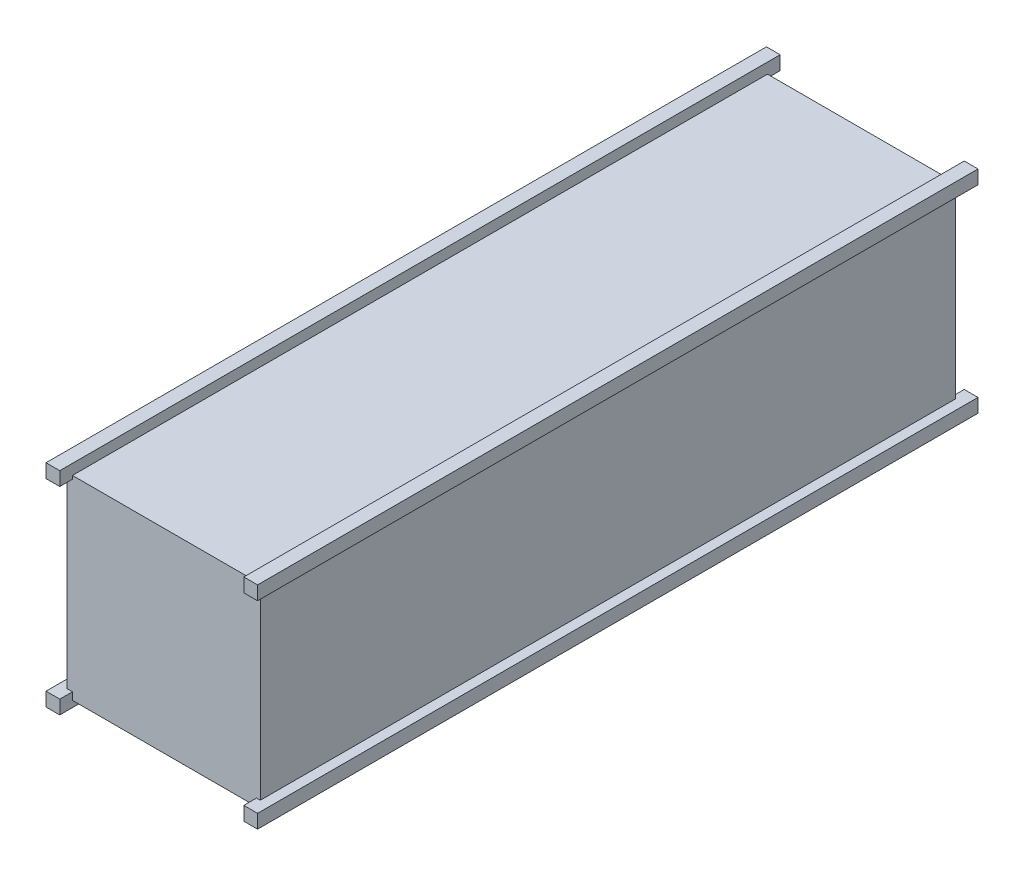
ISO-10303-21;
HEADER;
FILE_DESCRIPTION(('STEP AP214'),'2;1');
FILE_NAME('part.step','',(''),(''),'','','');
FILE_SCHEMA(('AUTOMOTIVE_DESIGN { 1 0 10303 214 1 1 1 1 }'));
ENDSEC;
DATA;
#1=APPLICATION_CONTEXT('core data for automotive mechanical design processes');
#2=APPLICATION_PROTOCOL_DEFINITION('international standard','automotive_design',2000,#1);
#3=PRODUCT_CONTEXT('',#1,'mechanical');
#4=PRODUCT('Part','Part','',(#3));
#5=PRODUCT_RELATED_PRODUCT_CATEGORY('part','',(#4));
#6=PRODUCT_DEFINITION_FORMATION('','',#4);
#7=PRODUCT_DEFINITION_CONTEXT('part definition',#1,'design');
#8=PRODUCT_DEFINITION('design','',#6,#7);
#9=PRODUCT_DEFINITION_SHAPE('','',#8);
#10=(LENGTH_UNIT() NAMED_UNIT(*) SI_UNIT(.MILLI.,.METRE.));
#11=(NAMED_UNIT(*) PLANE_ANGLE_UNIT() SI_UNIT($,.RADIAN.));
#12=(NAMED_UNIT(*) SI_UNIT($,.STERADIAN.) SOLID_ANGLE_UNIT());
#13=UNCERTAINTY_MEASURE_WITH_UNIT(LENGTH_MEASURE(1.E-05),#10,'distance_accuracy_value','');
#14=(GEOMETRIC_REPRESENTATION_CONTEXT(3) GLOBAL_UNCERTAINTY_ASSIGNED_CONTEXT((#13)) GLOBAL_UNIT_ASSIGNED_CONTEXT((#10,
#11,#12)) REPRESENTATION_CONTEXT('',''));
#15=CARTESIAN_POINT('',(0.,0.,0.));
#16=DIRECTION('',(0.,0.,1.));
#17=DIRECTION('',(1.,0.,0.));
#18=AXIS2_PLACEMENT_3D('',#15,#16,#17);
#19=CARTESIAN_POINT('',(0.,0.,-334.5));
#20=DIRECTION('',(0.,0.,-1.));
#21=DIRECTION('',(-1.,0.,0.));
#22=AXIS2_PLACEMENT_3D('',#19,#20,#21);
#23=PLANE('',#22);
#24=DIRECTION('',(0.,-1.,0.));
#25=VECTOR('',#24,1.);
#26=CARTESIAN_POINT('',(6.5,0.,-334.5));
#27=LINE('',#26,#25);
#28=CARTESIAN_POINT('',(6.5,6.5,-334.5));
#29=VERTEX_POINT('',#28);
#30=CARTESIAN_POINT('',(6.50000000000001,2.98357895199291,-334.5));
#31=VERTEX_POINT('',#30);
#32=EDGE_CURVE('E56',#29,#31,#27,.T.);
#33=ORIENTED_EDGE('',*,*,#32,.F.);
#34=DIRECTION('',(-1.,0.,0.));
#35=VECTOR('',#34,1.);
#36=CARTESIAN_POINT('',(0.,6.5,-334.5));
#37=LINE('',#36,#35);
#38=CARTESIAN_POINT('',(4.00091417674889,6.50000000000001,-334.5));
#39=VERTEX_POINT('',#38);
#40=EDGE_CURVE('E272',#29,#39,#37,.T.);
#41=ORIENTED_EDGE('',*,*,#40,.T.);
#42=DIRECTION('',(0.,1.,0.));
#43=VECTOR('',#42,1.);
#44=CARTESIAN_POINT('',(4.00091417674889,95.0524167923064,-334.5));
#45=LINE('',#44,#43);
#46=CARTESIAN_POINT('',(4.00091417674889,93.5,-334.5));
#47=VERTEX_POINT('',#46);
#48=EDGE_CURVE('E371',#39,#47,#45,.T.);
#49=ORIENTED_EDGE('',*,*,#48,.T.);
#50=DIRECTION('',(1.,0.,0.));
#51=VECTOR('',#50,1.);
#52=CARTESIAN_POINT('',(0.,93.5,-334.5));
#53=LINE('',#52,#51);
#54=CARTESIAN_POINT('',(6.5,93.5,-334.5));
#55=VERTEX_POINT('',#54);
#56=EDGE_CURVE('E427',#47,#55,#53,.T.);
#57=ORIENTED_EDGE('',*,*,#56,.T.);
#58=DIRECTION('',(0.,-1.,0.));
#59=VECTOR('',#58,1.);
#60=CARTESIAN_POINT('',(6.49999999999999,0.,-334.5));
#61=LINE('',#60,#59);
#62=CARTESIAN_POINT('',(6.50000000000001,95.0524167923064,-334.5));
#63=VERTEX_POINT('',#62);
#64=EDGE_CURVE('E387',#63,#55,#61,.T.);
#65=ORIENTED_EDGE('',*,*,#64,.F.);
#66=DIRECTION('',(1.,0.,0.));
#67=VECTOR('',#66,1.);
#68=CARTESIAN_POINT('',(95.3067505984963,95.0524167923064,-334.5));
#69=LINE('',#68,#67);
#70=CARTESIAN_POINT('',(93.5,95.0524167923064,-334.5));
#71=VERTEX_POINT('',#70);
#72=EDGE_CURVE('E373',#63,#71,#69,.T.);
#73=ORIENTED_EDGE('',*,*,#72,.T.);
#74=DIRECTION('',(0.,1.,0.));
#75=VECTOR('',#74,1.);
#76=CARTESIAN_POINT('',(93.5,0.,-334.5));
#77=LINE('',#76,#75);
#78=CARTESIAN_POINT('',(93.5,93.5,-334.5));
#79=VERTEX_POINT('',#78);
#80=EDGE_CURVE('E361',#79,#71,#77,.T.);
#81=ORIENTED_EDGE('',*,*,#80,.F.);
#82=DIRECTION('',(1.,0.,0.));
#83=VECTOR('',#82,1.);
#84=CARTESIAN_POINT('',(0.,93.5,-334.5));
#85=LINE('',#84,#83);
#86=CARTESIAN_POINT('',(95.3067505984963,93.5,-334.5));
#87=VERTEX_POINT('',#86);
#88=EDGE_CURVE('E356',#79,#87,#85,.T.);
#89=ORIENTED_EDGE('',*,*,#88,.T.);
#90=DIRECTION('',(0.,-1.,0.));
#91=VECTOR('',#90,1.);
#92=CARTESIAN_POINT('',(95.3067505984963,95.0524167923064,-334.5));
#93=LINE('',#92,#91);
#94=CARTESIAN_POINT('',(95.3067505984963,6.50000000000003,-334.5));
#95=VERTEX_POINT('',#94);
#96=EDGE_CURVE('E365',#87,#95,#93,.T.);
#97=ORIENTED_EDGE('',*,*,#96,.T.);
#98=DIRECTION('',(1.,0.,0.));
#99=VECTOR('',#98,1.);
#100=CARTESIAN_POINT('',(0.,6.49999999999999,-334.5));
#101=LINE('',#100,#99);
#102=CARTESIAN_POINT('',(93.5,6.5,-334.5));
#103=VERTEX_POINT('',#102);
#104=EDGE_CURVE('E318',#103,#95,#101,.T.);
#105=ORIENTED_EDGE('',*,*,#104,.F.);
#106=DIRECTION('',(0.,-1.,0.));
#107=VECTOR('',#106,1.);
#108=CARTESIAN_POINT('',(93.5,0.,-334.5));
#109=LINE('',#108,#107);
#110=CARTESIAN_POINT('',(93.5,2.98357895199291,-334.5));
#111=VERTEX_POINT('',#110);
#112=EDGE_CURVE('E313',#103,#111,#109,.T.);
#113=ORIENTED_EDGE('',*,*,#112,.T.);
#114=DIRECTION('',(-1.,0.,0.));
#115=VECTOR('',#114,1.);
#116=CARTESIAN_POINT('',(95.3067505984963,2.98357895199291,-334.5));
#117=LINE('',#116,#115);
#118=EDGE_CURVE('E368',#111,#31,#117,.T.);
#119=ORIENTED_EDGE('',*,*,#118,.T.);
#120=EDGE_LOOP('',(#33,#41,#49,#57,#65,#73,#81,#89,#97,#105,#113,#119));
#121=FACE_BOUND('',#120,.T.);
#122=ADVANCED_FACE('F41',(#121),#23,.T.);
#123=CARTESIAN_POINT('',(0.,0.,-6.));
#124=DIRECTION('',(0.,0.,-1.));
#125=DIRECTION('',(-1.,0.,0.));
#126=AXIS2_PLACEMENT_3D('',#123,#124,#125);
#127=PLANE('',#126);
#128=DIRECTION('',(-1.,0.,0.));
#129=VECTOR('',#128,1.);
#130=CARTESIAN_POINT('',(0.,6.5,-6.));
#131=LINE('',#130,#129);
#132=CARTESIAN_POINT('',(6.5,6.5,-6.));
#133=VERTEX_POINT('',#132);
#134=CARTESIAN_POINT('',(4.00091417674889,6.50000000000003,-6.));
#135=VERTEX_POINT('',#134);
#136=EDGE_CURVE('E64',#133,#135,#131,.T.);
#137=ORIENTED_EDGE('',*,*,#136,.F.);
#138=DIRECTION('',(0.,-1.,0.));
#139=VECTOR('',#138,1.);
#140=CARTESIAN_POINT('',(6.5,0.,-6.));
#141=LINE('',#140,#139);
#142=CARTESIAN_POINT('',(6.50000000000001,2.98357895199291,-6.));
#143=VERTEX_POINT('',#142);
#144=EDGE_CURVE('E274',#133,#143,#141,.T.);
#145=ORIENTED_EDGE('',*,*,#144,.T.);
#146=DIRECTION('',(-1.,0.,0.));
#147=VECTOR('',#146,1.);
#148=CARTESIAN_POINT('',(95.3067505984963,2.98357895199291,-6.));
#149=LINE('',#148,#147);
#150=CARTESIAN_POINT('',(93.5,2.98357895199291,-6.));
#151=VERTEX_POINT('',#150);
#152=EDGE_CURVE('E379',#151,#143,#149,.T.);
#153=ORIENTED_EDGE('',*,*,#152,.F.);
#154=DIRECTION('',(0.,-1.,0.));
#155=VECTOR('',#154,1.);
#156=CARTESIAN_POINT('',(93.5,0.,-6.));
#157=LINE('',#156,#155);
#158=CARTESIAN_POINT('',(93.5,6.5,-6.));
#159=VERTEX_POINT('',#158);
#160=EDGE_CURVE('E304',#159,#151,#157,.T.);
#161=ORIENTED_EDGE('',*,*,#160,.F.);
#162=DIRECTION('',(1.,0.,0.));
#163=VECTOR('',#162,1.);
#164=CARTESIAN_POINT('',(0.,6.49999999999999,-6.));
#165=LINE('',#164,#163);
#166=CARTESIAN_POINT('',(95.3067505984963,6.50000000000003,-6.));
#167=VERTEX_POINT('',#166);
#168=EDGE_CURVE('E316',#159,#167,#165,.T.);
#169=ORIENTED_EDGE('',*,*,#168,.T.);
#170=DIRECTION('',(0.,-1.,0.));
#171=VECTOR('',#170,1.);
#172=CARTESIAN_POINT('',(95.3067505984963,95.0524167923064,-6.));
#173=LINE('',#172,#171);
#174=CARTESIAN_POINT('',(95.3067505984963,93.5,-6.));
#175=VERTEX_POINT('',#174);
#176=EDGE_CURVE('E364',#175,#167,#173,.T.);
#177=ORIENTED_EDGE('',*,*,#176,.F.);
#178=DIRECTION('',(1.,0.,0.));
#179=VECTOR('',#178,1.);
#180=CARTESIAN_POINT('',(0.,93.5,-6.));
#181=LINE('',#180,#179);
#182=CARTESIAN_POINT('',(93.5,93.5,-6.));
#183=VERTEX_POINT('',#182);
#184=EDGE_CURVE('E346',#183,#175,#181,.T.);
#185=ORIENTED_EDGE('',*,*,#184,.F.);
#186=DIRECTION('',(0.,1.,0.));
#187=VECTOR('',#186,1.);
#188=CARTESIAN_POINT('',(93.5,0.,-6.));
#189=LINE('',#188,#187);
#190=CARTESIAN_POINT('',(93.5,95.0524167923064,-6.));
#191=VERTEX_POINT('',#190);
#192=EDGE_CURVE('E434',#183,#191,#189,.T.);
#193=ORIENTED_EDGE('',*,*,#192,.T.);
#194=DIRECTION('',(1.,0.,0.));
#195=VECTOR('',#194,1.);
#196=CARTESIAN_POINT('',(95.3067505984963,95.0524167923064,-6.));
#197=LINE('',#196,#195);
#198=CARTESIAN_POINT('',(6.50000000000001,95.0524167923064,-6.));
#199=VERTEX_POINT('',#198);
#200=EDGE_CURVE('E369',#199,#191,#197,.T.);
#201=ORIENTED_EDGE('',*,*,#200,.F.);
#202=DIRECTION('',(0.,-1.,0.));
#203=VECTOR('',#202,1.);
#204=CARTESIAN_POINT('',(6.49999999999999,0.,-6.00000000000001));
#205=LINE('',#204,#203);
#206=CARTESIAN_POINT('',(6.5,93.5,-6.00000000000001));
#207=VERTEX_POINT('',#206);
#208=EDGE_CURVE('E376',#199,#207,#205,.T.);
#209=ORIENTED_EDGE('',*,*,#208,.T.);
#210=DIRECTION('',(1.,0.,0.));
#211=VECTOR('',#210,1.);
#212=CARTESIAN_POINT('',(0.,93.5,-6.00000000000001));
#213=LINE('',#212,#211);
#214=CARTESIAN_POINT('',(4.00091417674889,93.5,-6.));
#215=VERTEX_POINT('',#214);
#216=EDGE_CURVE('E413',#215,#207,#213,.T.);
#217=ORIENTED_EDGE('',*,*,#216,.F.);
#218=DIRECTION('',(0.,1.,0.));
#219=VECTOR('',#218,1.);
#220=CARTESIAN_POINT('',(4.00091417674889,95.0524167923064,-6.));
#221=LINE('',#220,#219);
#222=EDGE_CURVE('E382',#135,#215,#221,.T.);
#223=ORIENTED_EDGE('',*,*,#222,.F.);
#224=EDGE_LOOP('',(#137,#145,#153,#161,#169,#177,#185,#193,#201,#209,#217,#223));
#225=FACE_BOUND('',#224,.T.);
#226=ADVANCED_FACE('F448',(#225),#127,.F.);
#227=CARTESIAN_POINT('',(4.00091417674889,95.0524167923064,-334.5));
#228=DIRECTION('',(1.,0.,0.));
#229=DIRECTION('',(0.,0.,-1.));
#230=AXIS2_PLACEMENT_3D('',#227,#228,#229);
#231=PLANE('',#230);
#232=DIRECTION('',(0.,0.,-1.));
#233=VECTOR('',#232,1.);
#234=CARTESIAN_POINT('',(4.00091417674889,6.50000000000001,-334.5));
#235=LINE('',#234,#233);
#236=EDGE_CURVE('E49',#135,#39,#235,.T.);
#237=ORIENTED_EDGE('',*,*,#236,.F.);
#238=ORIENTED_EDGE('',*,*,#222,.T.);
#239=DIRECTION('',(0.,0.,1.));
#240=VECTOR('',#239,1.);
#241=CARTESIAN_POINT('',(4.00091417674889,93.5,-340.5));
#242=LINE('',#241,#240);
#243=EDGE_CURVE('E424',#47,#215,#242,.T.);
#244=ORIENTED_EDGE('',*,*,#243,.F.);
#245=ORIENTED_EDGE('',*,*,#48,.F.);
#246=EDGE_LOOP('',(#237,#238,#244,#245));
#247=FACE_BOUND('',#246,.T.);
#248=ADVANCED_FACE('F445',(#247),#231,.F.);
#249=CARTESIAN_POINT('',(95.3067505984963,2.98357895199291,-334.5));
#250=DIRECTION('',(0.,1.,0.));
#251=DIRECTION('',(0.,0.,1.));
#252=AXIS2_PLACEMENT_3D('',#249,#250,#251);
#253=PLANE('',#252);
#254=ORIENTED_EDGE('',*,*,#152,.T.);
#255=DIRECTION('',(0.,0.,-1.));
#256=VECTOR('',#255,1.);
#257=CARTESIAN_POINT('',(6.50000000000001,2.98357895199291,-334.5));
#258=LINE('',#257,#256);
#259=EDGE_CURVE('E11',#143,#31,#258,.T.);
#260=ORIENTED_EDGE('',*,*,#259,.T.);
#261=ORIENTED_EDGE('',*,*,#118,.F.);
#262=DIRECTION('',(0.,0.,-1.));
#263=VECTOR('',#262,1.);
#264=CARTESIAN_POINT('',(93.5,2.98357895199291,-334.5));
#265=LINE('',#264,#263);
#266=EDGE_CURVE('E436',#151,#111,#265,.T.);
#267=ORIENTED_EDGE('',*,*,#266,.F.);
#268=EDGE_LOOP('',(#254,#260,#261,#267));
#269=FACE_BOUND('',#268,.T.);
#270=ADVANCED_FACE('F514',(#269),#253,.F.);
#271=CARTESIAN_POINT('',(95.3067505984963,95.0524167923064,-334.5));
#272=DIRECTION('',(-1.,0.,0.));
#273=DIRECTION('',(0.,0.,1.));
#274=AXIS2_PLACEMENT_3D('',#271,#272,#273);
#275=PLANE('',#274);
#276=ORIENTED_EDGE('',*,*,#176,.T.);
#277=DIRECTION('',(0.,0.,-1.));
#278=VECTOR('',#277,1.);
#279=CARTESIAN_POINT('',(95.3067505984963,6.50000000000001,-334.5));
#280=LINE('',#279,#278);
#281=EDGE_CURVE('E439',#167,#95,#280,.T.);
#282=ORIENTED_EDGE('',*,*,#281,.T.);
#283=ORIENTED_EDGE('',*,*,#96,.F.);
#284=DIRECTION('',(0.,0.,-1.));
#285=VECTOR('',#284,1.);
#286=CARTESIAN_POINT('',(95.3067505984963,93.5,-334.5));
#287=LINE('',#286,#285);
#288=EDGE_CURVE('E431',#175,#87,#287,.T.);
#289=ORIENTED_EDGE('',*,*,#288,.F.);
#290=EDGE_LOOP('',(#276,#282,#283,#289));
#291=FACE_BOUND('',#290,.T.);
#292=ADVANCED_FACE('F488',(#291),#275,.F.);
#293=CARTESIAN_POINT('',(6.49999999999999,0.,-340.5));
#294=DIRECTION('',(-1.,0.,0.));
#295=DIRECTION('',(0.,-1.,0.));
#296=AXIS2_PLACEMENT_3D('',#293,#294,#295);
#297=PLANE('',#296);
#298=DIRECTION('',(0.,0.,1.));
#299=VECTOR('',#298,1.);
#300=CARTESIAN_POINT('',(6.5,95.0524167923064,-340.5));
#301=LINE('',#300,#299);
#302=EDGE_CURVE('E429',#63,#199,#301,.T.);
#303=ORIENTED_EDGE('',*,*,#302,.F.);
#304=ORIENTED_EDGE('',*,*,#64,.T.);
#305=DIRECTION('',(0.,0.,1.));
#306=VECTOR('',#305,1.);
#307=CARTESIAN_POINT('',(6.5,93.5,-340.5));
#308=LINE('',#307,#306);
#309=CARTESIAN_POINT('',(6.5,93.5,-340.5));
#310=VERTEX_POINT('',#309);
#311=EDGE_CURVE('E410',#310,#55,#308,.T.);
#312=ORIENTED_EDGE('',*,*,#311,.F.);
#313=DIRECTION('',(0.,-1.,0.));
#314=VECTOR('',#313,1.);
#315=CARTESIAN_POINT('',(6.49999999999999,0.,-340.5));
#316=LINE('',#315,#314);
#317=CARTESIAN_POINT('',(6.5,100.,-340.5));
#318=VERTEX_POINT('',#317);
#319=EDGE_CURVE('E391',#318,#310,#316,.T.);
#320=ORIENTED_EDGE('',*,*,#319,.F.);
#321=DIRECTION('',(0.,0.,1.));
#322=VECTOR('',#321,1.);
#323=CARTESIAN_POINT('',(6.5,100.,-340.5));
#324=LINE('',#323,#322);
#325=CARTESIAN_POINT('',(6.5,100.,0.));
#326=VERTEX_POINT('',#325);
#327=EDGE_CURVE('E401',#318,#326,#324,.T.);
#328=ORIENTED_EDGE('',*,*,#327,.T.);
#329=DIRECTION('',(0.,-1.,0.));
#330=VECTOR('',#329,1.);
#331=CARTESIAN_POINT('',(6.49999999999999,0.,0.));
#332=LINE('',#331,#330);
#333=CARTESIAN_POINT('',(6.5,93.5,0.));
#334=VERTEX_POINT('',#333);
#335=EDGE_CURVE('E390',#326,#334,#332,.T.);
#336=ORIENTED_EDGE('',*,*,#335,.T.);
#337=EDGE_CURVE('E414',#207,#334,#308,.T.);
#338=ORIENTED_EDGE('',*,*,#337,.F.);
#339=ORIENTED_EDGE('',*,*,#208,.F.);
#340=EDGE_LOOP('',(#303,#304,#312,#320,#328,#336,#338,#339));
#341=FACE_BOUND('',#340,.T.);
#342=ADVANCED_FACE('F43',(#341),#297,.F.);
#343=CARTESIAN_POINT('',(0.,93.5,-340.5));
#344=DIRECTION('',(0.,-1.,0.));
#345=DIRECTION('',(0.,0.,-1.));
#346=AXIS2_PLACEMENT_3D('',#343,#344,#345);
#347=PLANE('',#346);
#348=ORIENTED_EDGE('',*,*,#56,.F.);
#349=ORIENTED_EDGE('',*,*,#243,.T.);
#350=ORIENTED_EDGE('',*,*,#216,.T.);
#351=ORIENTED_EDGE('',*,*,#337,.T.);
#352=DIRECTION('',(1.,0.,0.));
#353=VECTOR('',#352,1.);
#354=CARTESIAN_POINT('',(0.,93.5,0.));
#355=LINE('',#354,#353);
#356=CARTESIAN_POINT('',(0.,93.5,0.));
#357=VERTEX_POINT('',#356);
#358=EDGE_CURVE('E394',#357,#334,#355,.T.);
#359=ORIENTED_EDGE('',*,*,#358,.F.);
#360=DIRECTION('',(0.,0.,1.));
#361=VECTOR('',#360,1.);
#362=CARTESIAN_POINT('',(0.,93.5,-340.5));
#363=LINE('',#362,#361);
#364=CARTESIAN_POINT('',(0.,93.5,-340.5));
#365=VERTEX_POINT('',#364);
#366=EDGE_CURVE('E415',#365,#357,#363,.T.);
#367=ORIENTED_EDGE('',*,*,#366,.F.);
#368=DIRECTION('',(1.,0.,0.));
#369=VECTOR('',#368,1.);
#370=CARTESIAN_POINT('',(0.,93.5,-340.5));
#371=LINE('',#370,#369);
#372=EDGE_CURVE('E398',#365,#310,#371,.T.);
#373=ORIENTED_EDGE('',*,*,#372,.T.);
#374=ORIENTED_EDGE('',*,*,#311,.T.);
#375=EDGE_LOOP('',(#348,#349,#350,#351,#359,#367,#373,#374));
#376=FACE_BOUND('',#375,.T.);
#377=ADVANCED_FACE('F454',(#376),#347,.T.);
#378=CARTESIAN_POINT('',(0.,0.,-340.5));
#379=DIRECTION('',(1.,0.,0.));
#380=DIRECTION('',(0.,0.,-1.));
#381=AXIS2_PLACEMENT_3D('',#378,#379,#380);
#382=PLANE('',#381);
#383=DIRECTION('',(0.,1.,0.));
#384=VECTOR('',#383,1.);
#385=CARTESIAN_POINT('',(0.,0.,0.));
#386=LINE('',#385,#384);
#387=CARTESIAN_POINT('',(0.,100.,0.));
#388=VERTEX_POINT('',#387);
#389=EDGE_CURVE('E406',#357,#388,#386,.T.);
#390=ORIENTED_EDGE('',*,*,#389,.T.);
#391=DIRECTION('',(0.,0.,1.));
#392=VECTOR('',#391,1.);
#393=CARTESIAN_POINT('',(0.,100.,-340.5));
#394=LINE('',#393,#392);
#395=CARTESIAN_POINT('',(0.,100.,-340.5));
#396=VERTEX_POINT('',#395);
#397=EDGE_CURVE('E417',#396,#388,#394,.T.);
#398=ORIENTED_EDGE('',*,*,#397,.F.);
#399=DIRECTION('',(0.,1.,0.));
#400=VECTOR('',#399,1.);
#401=CARTESIAN_POINT('',(0.,0.,-340.5));
#402=LINE('',#401,#400);
#403=EDGE_CURVE('E396',#365,#396,#402,.T.);
#404=ORIENTED_EDGE('',*,*,#403,.F.);
#405=ORIENTED_EDGE('',*,*,#366,.T.);
#406=EDGE_LOOP('',(#390,#398,#404,#405));
#407=FACE_BOUND('',#406,.T.);
#408=ADVANCED_FACE('F560',(#407),#382,.F.);
#409=CARTESIAN_POINT('',(0.,100.,-340.5));
#410=DIRECTION('',(0.,-1.,0.));
#411=DIRECTION('',(0.,0.,-1.));
#412=AXIS2_PLACEMENT_3D('',#409,#410,#411);
#413=PLANE('',#412);
#414=DIRECTION('',(1.,0.,0.));
#415=VECTOR('',#414,1.);
#416=CARTESIAN_POINT('',(0.,100.,0.));
#417=LINE('',#416,#415);
#418=EDGE_CURVE('E404',#388,#326,#417,.T.);
#419=ORIENTED_EDGE('',*,*,#418,.T.);
#420=ORIENTED_EDGE('',*,*,#327,.F.);
#421=DIRECTION('',(1.,0.,0.));
#422=VECTOR('',#421,1.);
#423=CARTESIAN_POINT('',(0.,100.,-340.5));
#424=LINE('',#423,#422);
#425=EDGE_CURVE('E393',#396,#318,#424,.T.);
#426=ORIENTED_EDGE('',*,*,#425,.F.);
#427=ORIENTED_EDGE('',*,*,#397,.T.);
#428=EDGE_LOOP('',(#419,#420,#426,#427));
#429=FACE_BOUND('',#428,.T.);
#430=ADVANCED_FACE('F554',(#429),#413,.F.);
#431=CARTESIAN_POINT('',(0.,0.,-340.5));
#432=DIRECTION('',(0.,0.,1.));
#433=DIRECTION('',(1.,0.,0.));
#434=AXIS2_PLACEMENT_3D('',#431,#432,#433);
#435=PLANE('',#434);
#436=ORIENTED_EDGE('',*,*,#319,.T.);
#437=ORIENTED_EDGE('',*,*,#372,.F.);
#438=ORIENTED_EDGE('',*,*,#403,.T.);
#439=ORIENTED_EDGE('',*,*,#425,.T.);
#440=EDGE_LOOP('',(#436,#437,#438,#439));
#441=FACE_BOUND('',#440,.T.);
#442=ADVANCED_FACE('F551',(#441),#435,.F.);
#443=CARTESIAN_POINT('',(0.,0.,0.));
#444=DIRECTION('',(0.,0.,1.));
#445=DIRECTION('',(1.,0.,0.));
#446=AXIS2_PLACEMENT_3D('',#443,#444,#445);
#447=PLANE('',#446);
#448=ORIENTED_EDGE('',*,*,#335,.F.);
#449=ORIENTED_EDGE('',*,*,#418,.F.);
#450=ORIENTED_EDGE('',*,*,#389,.F.);
#451=ORIENTED_EDGE('',*,*,#358,.T.);
#452=EDGE_LOOP('',(#448,#449,#450,#451));
#453=FACE_BOUND('',#452,.T.);
#454=ADVANCED_FACE('F544',(#453),#447,.T.);
#455=CARTESIAN_POINT('',(95.3067505984963,95.0524167923064,-334.5));
#456=DIRECTION('',(0.,-1.,0.));
#457=DIRECTION('',(0.,0.,-1.));
#458=AXIS2_PLACEMENT_3D('',#455,#456,#457);
#459=PLANE('',#458);
#460=ORIENTED_EDGE('',*,*,#200,.T.);
#461=DIRECTION('',(0.,0.,-1.));
#462=VECTOR('',#461,1.);
#463=CARTESIAN_POINT('',(93.5,95.0524167923064,-334.5));
#464=LINE('',#463,#462);
#465=EDGE_CURVE('E359',#191,#71,#464,.T.);
#466=ORIENTED_EDGE('',*,*,#465,.T.);
#467=ORIENTED_EDGE('',*,*,#72,.F.);
#468=ORIENTED_EDGE('',*,*,#302,.T.);
#469=EDGE_LOOP('',(#460,#466,#467,#468));
#470=FACE_BOUND('',#469,.T.);
#471=ADVANCED_FACE('F461',(#470),#459,.F.);
#472=CARTESIAN_POINT('',(0.,100.,-340.5));
#473=DIRECTION('',(0.,-1.,0.));
#474=DIRECTION('',(0.,0.,-1.));
#475=AXIS2_PLACEMENT_3D('',#472,#473,#474);
#476=PLANE('',#475);
#477=DIRECTION('',(1.,0.,0.));
#478=VECTOR('',#477,1.);
#479=CARTESIAN_POINT('',(0.,100.,0.));
#480=LINE('',#479,#478);
#481=CARTESIAN_POINT('',(93.5,100.,0.));
#482=VERTEX_POINT('',#481);
#483=CARTESIAN_POINT('',(100.,100.,0.));
#484=VERTEX_POINT('',#483);
#485=EDGE_CURVE('E321',#482,#484,#480,.T.);
#486=ORIENTED_EDGE('',*,*,#485,.T.);
#487=DIRECTION('',(0.,0.,1.));
#488=VECTOR('',#487,1.);
#489=CARTESIAN_POINT('',(100.,100.,-340.5));
#490=LINE('',#489,#488);
#491=CARTESIAN_POINT('',(100.,100.,-340.5));
#492=VERTEX_POINT('',#491);
#493=EDGE_CURVE('E344',#492,#484,#490,.T.);
#494=ORIENTED_EDGE('',*,*,#493,.F.);
#495=DIRECTION('',(1.,0.,0.));
#496=VECTOR('',#495,1.);
#497=CARTESIAN_POINT('',(0.,100.,-340.5));
#498=LINE('',#497,#496);
#499=CARTESIAN_POINT('',(93.5,100.,-340.5));
#500=VERTEX_POINT('',#499);
#501=EDGE_CURVE('E322',#500,#492,#498,.T.);
#502=ORIENTED_EDGE('',*,*,#501,.F.);
#503=DIRECTION('',(0.,0.,1.));
#504=VECTOR('',#503,1.);
#505=CARTESIAN_POINT('',(93.5,100.,-340.5));
#506=LINE('',#505,#504);
#507=EDGE_CURVE('E333',#500,#482,#506,.T.);
#508=ORIENTED_EDGE('',*,*,#507,.T.);
#509=EDGE_LOOP('',(#486,#494,#502,#508));
#510=FACE_BOUND('',#509,.T.);
#511=ADVANCED_FACE('F482',(#510),#476,.F.);
#512=CARTESIAN_POINT('',(100.,0.,-340.5));
#513=DIRECTION('',(1.,0.,0.));
#514=DIRECTION('',(0.,0.,-1.));
#515=AXIS2_PLACEMENT_3D('',#512,#513,#514);
#516=PLANE('',#515);
#517=DIRECTION('',(0.,1.,0.));
#518=VECTOR('',#517,1.);
#519=CARTESIAN_POINT('',(100.,0.,0.));
#520=LINE('',#519,#518);
#521=CARTESIAN_POINT('',(100.,93.5,0.));
#522=VERTEX_POINT('',#521);
#523=EDGE_CURVE('E325',#522,#484,#520,.T.);
#524=ORIENTED_EDGE('',*,*,#523,.F.);
#525=DIRECTION('',(0.,0.,1.));
#526=VECTOR('',#525,1.);
#527=CARTESIAN_POINT('',(100.,93.5,-340.5));
#528=LINE('',#527,#526);
#529=CARTESIAN_POINT('',(100.,93.5,-340.5));
#530=VERTEX_POINT('',#529);
#531=EDGE_CURVE('E347',#530,#522,#528,.T.);
#532=ORIENTED_EDGE('',*,*,#531,.F.);
#533=DIRECTION('',(0.,1.,0.));
#534=VECTOR('',#533,1.);
#535=CARTESIAN_POINT('',(100.,0.,-340.5));
#536=LINE('',#535,#534);
#537=EDGE_CURVE('E330',#530,#492,#536,.T.);
#538=ORIENTED_EDGE('',*,*,#537,.T.);
#539=ORIENTED_EDGE('',*,*,#493,.T.);
#540=EDGE_LOOP('',(#524,#532,#538,#539));
#541=FACE_BOUND('',#540,.T.);
#542=ADVANCED_FACE('F598',(#541),#516,.T.);
#543=CARTESIAN_POINT('',(0.,93.5,-340.5));
#544=DIRECTION('',(0.,1.,0.));
#545=DIRECTION('',(0.,0.,1.));
#546=AXIS2_PLACEMENT_3D('',#543,#544,#545);
#547=PLANE('',#546);
#548=ORIENTED_EDGE('',*,*,#88,.F.);
#549=DIRECTION('',(0.,0.,1.));
#550=VECTOR('',#549,1.);
#551=CARTESIAN_POINT('',(93.5,93.5,-340.5));
#552=LINE('',#551,#550);
#553=CARTESIAN_POINT('',(93.5,93.5,-340.5));
#554=VERTEX_POINT('',#553);
#555=EDGE_CURVE('E349',#554,#79,#552,.T.);
#556=ORIENTED_EDGE('',*,*,#555,.F.);
#557=DIRECTION('',(-1.,0.,0.));
#558=VECTOR('',#557,1.);
#559=CARTESIAN_POINT('',(0.,93.5,-340.5));
#560=LINE('',#559,#558);
#561=EDGE_CURVE('E328',#530,#554,#560,.T.);
#562=ORIENTED_EDGE('',*,*,#561,.F.);
#563=ORIENTED_EDGE('',*,*,#531,.T.);
#564=DIRECTION('',(-1.,0.,0.));
#565=VECTOR('',#564,1.);
#566=CARTESIAN_POINT('',(0.,93.5,0.));
#567=LINE('',#566,#565);
#568=CARTESIAN_POINT('',(93.5,93.5,0.));
#569=VERTEX_POINT('',#568);
#570=EDGE_CURVE('E339',#522,#569,#567,.T.);
#571=ORIENTED_EDGE('',*,*,#570,.T.);
#572=EDGE_CURVE('E352',#183,#569,#552,.T.);
#573=ORIENTED_EDGE('',*,*,#572,.F.);
#574=ORIENTED_EDGE('',*,*,#184,.T.);
#575=ORIENTED_EDGE('',*,*,#288,.T.);
#576=EDGE_LOOP('',(#548,#556,#562,#563,#571,#573,#574,#575));
#577=FACE_BOUND('',#576,.T.);
#578=ADVANCED_FACE('F471',(#577),#547,.F.);
#579=CARTESIAN_POINT('',(93.5,0.,-340.5));
#580=DIRECTION('',(-1.,0.,0.));
#581=DIRECTION('',(0.,0.,1.));
#582=AXIS2_PLACEMENT_3D('',#579,#580,#581);
#583=PLANE('',#582);
#584=ORIENTED_EDGE('',*,*,#555,.T.);
#585=ORIENTED_EDGE('',*,*,#80,.T.);
#586=ORIENTED_EDGE('',*,*,#465,.F.);
#587=ORIENTED_EDGE('',*,*,#192,.F.);
#588=ORIENTED_EDGE('',*,*,#572,.T.);
#589=DIRECTION('',(0.,-1.,0.));
#590=VECTOR('',#589,1.);
#591=CARTESIAN_POINT('',(93.5,0.,0.));
#592=LINE('',#591,#590);
#593=EDGE_CURVE('E336',#482,#569,#592,.T.);
#594=ORIENTED_EDGE('',*,*,#593,.F.);
#595=ORIENTED_EDGE('',*,*,#507,.F.);
#596=DIRECTION('',(0.,-1.,0.));
#597=VECTOR('',#596,1.);
#598=CARTESIAN_POINT('',(93.5,0.,-340.5));
#599=LINE('',#598,#597);
#600=EDGE_CURVE('E324',#500,#554,#599,.T.);
#601=ORIENTED_EDGE('',*,*,#600,.T.);
#602=EDGE_LOOP('',(#584,#585,#586,#587,#588,#594,#595,#601));
#603=FACE_BOUND('',#602,.T.);
#604=ADVANCED_FACE('F467',(#603),#583,.T.);
#605=CARTESIAN_POINT('',(0.,0.,-340.5));
#606=DIRECTION('',(0.,0.,1.));
#607=DIRECTION('',(1.,0.,0.));
#608=AXIS2_PLACEMENT_3D('',#605,#606,#607);
#609=PLANE('',#608);
#610=ORIENTED_EDGE('',*,*,#501,.T.);
#611=ORIENTED_EDGE('',*,*,#537,.F.);
#612=ORIENTED_EDGE('',*,*,#561,.T.);
#613=ORIENTED_EDGE('',*,*,#600,.F.);
#614=EDGE_LOOP('',(#610,#611,#612,#613));
#615=FACE_BOUND('',#614,.T.);
#616=ADVANCED_FACE('F485',(#615),#609,.F.);
#617=CARTESIAN_POINT('',(0.,0.,0.));
#618=DIRECTION('',(0.,0.,1.));
#619=DIRECTION('',(1.,0.,0.));
#620=AXIS2_PLACEMENT_3D('',#617,#618,#619);
#621=PLANE('',#620);
#622=ORIENTED_EDGE('',*,*,#485,.F.);
#623=ORIENTED_EDGE('',*,*,#593,.T.);
#624=ORIENTED_EDGE('',*,*,#570,.F.);
#625=ORIENTED_EDGE('',*,*,#523,.T.);
#626=EDGE_LOOP('',(#622,#623,#624,#625));
#627=FACE_BOUND('',#626,.T.);
#628=ADVANCED_FACE('F477',(#627),#621,.T.);
#629=CARTESIAN_POINT('',(93.5,0.,-340.5));
#630=DIRECTION('',(1.,0.,0.));
#631=DIRECTION('',(0.,0.,-1.));
#632=AXIS2_PLACEMENT_3D('',#629,#630,#631);
#633=PLANE('',#632);
#634=ORIENTED_EDGE('',*,*,#112,.F.);
#635=DIRECTION('',(0.,0.,1.));
#636=VECTOR('',#635,1.);
#637=CARTESIAN_POINT('',(93.5,6.5,-340.5));
#638=LINE('',#637,#636);
#639=CARTESIAN_POINT('',(93.5,6.5,-340.5));
#640=VERTEX_POINT('',#639);
#641=EDGE_CURVE('E301',#640,#103,#638,.T.);
#642=ORIENTED_EDGE('',*,*,#641,.F.);
#643=DIRECTION('',(0.,1.,0.));
#644=VECTOR('',#643,1.);
#645=CARTESIAN_POINT('',(93.5,0.,-340.5));
#646=LINE('',#645,#644);
#647=CARTESIAN_POINT('',(93.5,0.,-340.5));
#648=VERTEX_POINT('',#647);
#649=EDGE_CURVE('E278',#648,#640,#646,.T.);
#650=ORIENTED_EDGE('',*,*,#649,.F.);
#651=DIRECTION('',(0.,0.,1.));
#652=VECTOR('',#651,1.);
#653=CARTESIAN_POINT('',(93.5,0.,-340.5));
#654=LINE('',#653,#652);
#655=CARTESIAN_POINT('',(93.5,0.,0.));
#656=VERTEX_POINT('',#655);
#657=EDGE_CURVE('E290',#648,#656,#654,.T.);
#658=ORIENTED_EDGE('',*,*,#657,.T.);
#659=DIRECTION('',(0.,1.,0.));
#660=VECTOR('',#659,1.);
#661=CARTESIAN_POINT('',(93.5,0.,0.));
#662=LINE('',#661,#660);
#663=CARTESIAN_POINT('',(93.5,6.5,0.));
#664=VERTEX_POINT('',#663);
#665=EDGE_CURVE('E277',#656,#664,#662,.T.);
#666=ORIENTED_EDGE('',*,*,#665,.T.);
#667=EDGE_CURVE('E305',#159,#664,#638,.T.);
#668=ORIENTED_EDGE('',*,*,#667,.F.);
#669=ORIENTED_EDGE('',*,*,#160,.T.);
#670=ORIENTED_EDGE('',*,*,#266,.T.);
#671=EDGE_LOOP('',(#634,#642,#650,#658,#666,#668,#669,#670));
#672=FACE_BOUND('',#671,.T.);
#673=ADVANCED_FACE('F498',(#672),#633,.F.);
#674=CARTESIAN_POINT('',(0.,6.49999999999999,-340.5));
#675=DIRECTION('',(0.,1.,0.));
#676=DIRECTION('',(-1.,0.,0.));
#677=AXIS2_PLACEMENT_3D('',#674,#675,#676);
#678=PLANE('',#677);
#679=ORIENTED_EDGE('',*,*,#641,.T.);
#680=ORIENTED_EDGE('',*,*,#104,.T.);
#681=ORIENTED_EDGE('',*,*,#281,.F.);
#682=ORIENTED_EDGE('',*,*,#168,.F.);
#683=ORIENTED_EDGE('',*,*,#667,.T.);
#684=DIRECTION('',(-1.,0.,0.));
#685=VECTOR('',#684,1.);
#686=CARTESIAN_POINT('',(0.,6.49999999999999,0.));
#687=LINE('',#686,#685);
#688=CARTESIAN_POINT('',(100.,6.5,0.));
#689=VERTEX_POINT('',#688);
#690=EDGE_CURVE('E281',#689,#664,#687,.T.);
#691=ORIENTED_EDGE('',*,*,#690,.F.);
#692=DIRECTION('',(0.,0.,1.));
#693=VECTOR('',#692,1.);
#694=CARTESIAN_POINT('',(100.,6.5,-340.5));
#695=LINE('',#694,#693);
#696=CARTESIAN_POINT('',(100.,6.5,-340.5));
#697=VERTEX_POINT('',#696);
#698=EDGE_CURVE('E306',#697,#689,#695,.T.);
#699=ORIENTED_EDGE('',*,*,#698,.F.);
#700=DIRECTION('',(-1.,0.,0.));
#701=VECTOR('',#700,1.);
#702=CARTESIAN_POINT('',(0.,6.49999999999999,-340.5));
#703=LINE('',#702,#701);
#704=EDGE_CURVE('E287',#697,#640,#703,.T.);
#705=ORIENTED_EDGE('',*,*,#704,.T.);
#706=EDGE_LOOP('',(#679,#680,#681,#682,#683,#691,#699,#705));
#707=FACE_BOUND('',#706,.T.);
#708=ADVANCED_FACE('F494',(#707),#678,.T.);
#709=CARTESIAN_POINT('',(100.,0.,-340.5));
#710=DIRECTION('',(1.,0.,0.));
#711=DIRECTION('',(0.,0.,-1.));
#712=AXIS2_PLACEMENT_3D('',#709,#710,#711);
#713=PLANE('',#712);
#714=DIRECTION('',(0.,1.,0.));
#715=VECTOR('',#714,1.);
#716=CARTESIAN_POINT('',(100.,0.,0.));
#717=LINE('',#716,#715);
#718=CARTESIAN_POINT('',(100.,0.,0.));
#719=VERTEX_POINT('',#718);
#720=EDGE_CURVE('E296',#719,#689,#717,.T.);
#721=ORIENTED_EDGE('',*,*,#720,.F.);
#722=DIRECTION('',(0.,0.,1.));
#723=VECTOR('',#722,1.);
#724=CARTESIAN_POINT('',(100.,0.,-340.5));
#725=LINE('',#724,#723);
#726=CARTESIAN_POINT('',(100.,0.,-340.5));
#727=VERTEX_POINT('',#726);
#728=EDGE_CURVE('E308',#727,#719,#725,.T.);
#729=ORIENTED_EDGE('',*,*,#728,.F.);
#730=DIRECTION('',(0.,1.,0.));
#731=VECTOR('',#730,1.);
#732=CARTESIAN_POINT('',(100.,0.,-340.5));
#733=LINE('',#732,#731);
#734=EDGE_CURVE('E284',#727,#697,#733,.T.);
#735=ORIENTED_EDGE('',*,*,#734,.T.);
#736=ORIENTED_EDGE('',*,*,#698,.T.);
#737=EDGE_LOOP('',(#721,#729,#735,#736));
#738=FACE_BOUND('',#737,.T.);
#739=ADVANCED_FACE('F508',(#738),#713,.T.);
#740=CARTESIAN_POINT('',(0.,0.,-340.5));
#741=DIRECTION('',(0.,-1.,0.));
#742=DIRECTION('',(0.,0.,-1.));
#743=AXIS2_PLACEMENT_3D('',#740,#741,#742);
#744=PLANE('',#743);
#745=DIRECTION('',(1.,0.,0.));
#746=VECTOR('',#745,1.);
#747=CARTESIAN_POINT('',(0.,0.,0.));
#748=LINE('',#747,#746);
#749=EDGE_CURVE('E293',#656,#719,#748,.T.);
#750=ORIENTED_EDGE('',*,*,#749,.F.);
#751=ORIENTED_EDGE('',*,*,#657,.F.);
#752=DIRECTION('',(1.,0.,0.));
#753=VECTOR('',#752,1.);
#754=CARTESIAN_POINT('',(0.,0.,-340.5));
#755=LINE('',#754,#753);
#756=EDGE_CURVE('E280',#648,#727,#755,.T.);
#757=ORIENTED_EDGE('',*,*,#756,.T.);
#758=ORIENTED_EDGE('',*,*,#728,.T.);
#759=EDGE_LOOP('',(#750,#751,#757,#758));
#760=FACE_BOUND('',#759,.T.);
#761=ADVANCED_FACE('F665',(#760),#744,.T.);
#762=CARTESIAN_POINT('',(0.,0.,-340.5));
#763=DIRECTION('',(0.,0.,1.));
#764=DIRECTION('',(1.,0.,0.));
#765=AXIS2_PLACEMENT_3D('',#762,#763,#764);
#766=PLANE('',#765);
#767=ORIENTED_EDGE('',*,*,#649,.T.);
#768=ORIENTED_EDGE('',*,*,#704,.F.);
#769=ORIENTED_EDGE('',*,*,#734,.F.);
#770=ORIENTED_EDGE('',*,*,#756,.F.);
#771=EDGE_LOOP('',(#767,#768,#769,#770));
#772=FACE_BOUND('',#771,.T.);
#773=ADVANCED_FACE('F511',(#772),#766,.F.);
#774=CARTESIAN_POINT('',(0.,0.,0.));
#775=DIRECTION('',(0.,0.,1.));
#776=DIRECTION('',(1.,0.,0.));
#777=AXIS2_PLACEMENT_3D('',#774,#775,#776);
#778=PLANE('',#777);
#779=ORIENTED_EDGE('',*,*,#665,.F.);
#780=ORIENTED_EDGE('',*,*,#749,.T.);
#781=ORIENTED_EDGE('',*,*,#720,.T.);
#782=ORIENTED_EDGE('',*,*,#690,.T.);
#783=EDGE_LOOP('',(#779,#780,#781,#782));
#784=FACE_BOUND('',#783,.T.);
#785=ADVANCED_FACE('F503',(#784),#778,.T.);
#786=CARTESIAN_POINT('',(0.,0.,-340.5));
#787=DIRECTION('',(0.,-1.,0.));
#788=DIRECTION('',(0.,0.,-1.));
#789=AXIS2_PLACEMENT_3D('',#786,#787,#788);
#790=PLANE('',#789);
#791=DIRECTION('',(1.,0.,0.));
#792=VECTOR('',#791,1.);
#793=CARTESIAN_POINT('',(0.,0.,0.));
#794=LINE('',#793,#792);
#795=CARTESIAN_POINT('',(0.,0.,0.));
#796=VERTEX_POINT('',#795);
#797=CARTESIAN_POINT('',(6.5,0.,0.));
#798=VERTEX_POINT('',#797);
#799=EDGE_CURVE('E260',#796,#798,#794,.T.);
#800=ORIENTED_EDGE('',*,*,#799,.F.);
#801=DIRECTION('',(0.,0.,1.));
#802=VECTOR('',#801,1.);
#803=CARTESIAN_POINT('',(0.,0.,-340.5));
#804=LINE('',#803,#802);
#805=CARTESIAN_POINT('',(0.,0.,-340.5));
#806=VERTEX_POINT('',#805);
#807=EDGE_CURVE('E251',#806,#796,#804,.T.);
#808=ORIENTED_EDGE('',*,*,#807,.F.);
#809=DIRECTION('',(1.,0.,0.));
#810=VECTOR('',#809,1.);
#811=CARTESIAN_POINT('',(0.,0.,-340.5));
#812=LINE('',#811,#810);
#813=CARTESIAN_POINT('',(6.5,0.,-340.5));
#814=VERTEX_POINT('',#813);
#815=EDGE_CURVE('E245',#806,#814,#812,.T.);
#816=ORIENTED_EDGE('',*,*,#815,.T.);
#817=DIRECTION('',(0.,0.,1.));
#818=VECTOR('',#817,1.);
#819=CARTESIAN_POINT('',(6.5,0.,-340.5));
#820=LINE('',#819,#818);
#821=EDGE_CURVE('E228',#814,#798,#820,.T.);
#822=ORIENTED_EDGE('',*,*,#821,.T.);
#823=EDGE_LOOP('',(#800,#808,#816,#822));
#824=FACE_BOUND('',#823,.T.);
#825=ADVANCED_FACE('F250',(#824),#790,.T.);
#826=CARTESIAN_POINT('',(0.,0.,-340.5));
#827=DIRECTION('',(1.,0.,0.));
#828=DIRECTION('',(0.,0.,-1.));
#829=AXIS2_PLACEMENT_3D('',#826,#827,#828);
#830=PLANE('',#829);
#831=DIRECTION('',(0.,1.,0.));
#832=VECTOR('',#831,1.);
#833=CARTESIAN_POINT('',(0.,0.,0.));
#834=LINE('',#833,#832);
#835=CARTESIAN_POINT('',(0.,6.5,0.));
#836=VERTEX_POINT('',#835);
#837=EDGE_CURVE('E253',#796,#836,#834,.T.);
#838=ORIENTED_EDGE('',*,*,#837,.T.);
#839=DIRECTION('',(0.,0.,1.));
#840=VECTOR('',#839,1.);
#841=CARTESIAN_POINT('',(0.,6.5,-340.5));
#842=LINE('',#841,#840);
#843=CARTESIAN_POINT('',(0.,6.5,-340.5));
#844=VERTEX_POINT('',#843);
#845=EDGE_CURVE('E266',#844,#836,#842,.T.);
#846=ORIENTED_EDGE('',*,*,#845,.F.);
#847=DIRECTION('',(0.,1.,0.));
#848=VECTOR('',#847,1.);
#849=CARTESIAN_POINT('',(0.,0.,-340.5));
#850=LINE('',#849,#848);
#851=EDGE_CURVE('E240',#806,#844,#850,.T.);
#852=ORIENTED_EDGE('',*,*,#851,.F.);
#853=ORIENTED_EDGE('',*,*,#807,.T.);
#854=EDGE_LOOP('',(#838,#846,#852,#853));
#855=FACE_BOUND('',#854,.T.);
#856=ADVANCED_FACE('F522',(#855),#830,.F.);
#857=CARTESIAN_POINT('',(0.,6.5,-340.5));
#858=DIRECTION('',(0.,-1.,0.));
#859=DIRECTION('',(0.,0.,-1.));
#860=AXIS2_PLACEMENT_3D('',#857,#858,#859);
#861=PLANE('',#860);
#862=ORIENTED_EDGE('',*,*,#40,.F.);
#863=DIRECTION('',(0.,0.,1.));
#864=VECTOR('',#863,1.);
#865=CARTESIAN_POINT('',(6.5,6.5,-340.5));
#866=LINE('',#865,#864);
#867=CARTESIAN_POINT('',(6.5,6.5,-340.5));
#868=VERTEX_POINT('',#867);
#869=EDGE_CURVE('E269',#868,#29,#866,.T.);
#870=ORIENTED_EDGE('',*,*,#869,.F.);
#871=DIRECTION('',(1.,0.,0.));
#872=VECTOR('',#871,1.);
#873=CARTESIAN_POINT('',(0.,6.5,-340.5));
#874=LINE('',#873,#872);
#875=EDGE_CURVE('E247',#844,#868,#874,.T.);
#876=ORIENTED_EDGE('',*,*,#875,.F.);
#877=ORIENTED_EDGE('',*,*,#845,.T.);
#878=DIRECTION('',(1.,0.,0.));
#879=VECTOR('',#878,1.);
#880=CARTESIAN_POINT('',(0.,6.5,0.));
#881=LINE('',#880,#879);
#882=CARTESIAN_POINT('',(6.5,6.5,0.));
#883=VERTEX_POINT('',#882);
#884=EDGE_CURVE('E255',#836,#883,#881,.T.);
#885=ORIENTED_EDGE('',*,*,#884,.T.);
#886=EDGE_CURVE('E239',#133,#883,#866,.T.);
#887=ORIENTED_EDGE('',*,*,#886,.F.);
#888=ORIENTED_EDGE('',*,*,#136,.T.);
#889=ORIENTED_EDGE('',*,*,#236,.T.);
#890=EDGE_LOOP('',(#862,#870,#876,#877,#885,#887,#888,#889));
#891=FACE_BOUND('',#890,.T.);
#892=ADVANCED_FACE('F442',(#891),#861,.F.);
#893=CARTESIAN_POINT('',(6.5,0.,-340.5));
#894=DIRECTION('',(1.,0.,0.));
#895=DIRECTION('',(0.,1.,0.));
#896=AXIS2_PLACEMENT_3D('',#893,#894,#895);
#897=PLANE('',#896);
#898=ORIENTED_EDGE('',*,*,#869,.T.);
#899=ORIENTED_EDGE('',*,*,#32,.T.);
#900=ORIENTED_EDGE('',*,*,#259,.F.);
#901=ORIENTED_EDGE('',*,*,#144,.F.);
#902=ORIENTED_EDGE('',*,*,#886,.T.);
#903=DIRECTION('',(0.,1.,0.));
#904=VECTOR('',#903,1.);
#905=CARTESIAN_POINT('',(6.5,0.,0.));
#906=LINE('',#905,#904);
#907=EDGE_CURVE('E234',#798,#883,#906,.T.);
#908=ORIENTED_EDGE('',*,*,#907,.F.);
#909=ORIENTED_EDGE('',*,*,#821,.F.);
#910=DIRECTION('',(0.,1.,0.));
#911=VECTOR('',#910,1.);
#912=CARTESIAN_POINT('',(6.5,0.,-340.5));
#913=LINE('',#912,#911);
#914=EDGE_CURVE('E232',#814,#868,#913,.T.);
#915=ORIENTED_EDGE('',*,*,#914,.T.);
#916=EDGE_LOOP('',(#898,#899,#900,#901,#902,#908,#909,#915));
#917=FACE_BOUND('',#916,.T.);
#918=ADVANCED_FACE('F231',(#917),#897,.T.);
#919=CARTESIAN_POINT('',(0.,0.,-340.5));
#920=DIRECTION('',(0.,0.,1.));
#921=DIRECTION('',(1.,0.,0.));
#922=AXIS2_PLACEMENT_3D('',#919,#920,#921);
#923=PLANE('',#922);
#924=ORIENTED_EDGE('',*,*,#815,.F.);
#925=ORIENTED_EDGE('',*,*,#851,.T.);
#926=ORIENTED_EDGE('',*,*,#875,.T.);
#927=ORIENTED_EDGE('',*,*,#914,.F.);
#928=EDGE_LOOP('',(#924,#925,#926,#927));
#929=FACE_BOUND('',#928,.T.);
#930=ADVANCED_FACE('F244',(#929),#923,.F.);
#931=CARTESIAN_POINT('',(0.,0.,0.));
#932=DIRECTION('',(0.,0.,1.));
#933=DIRECTION('',(1.,0.,0.));
#934=AXIS2_PLACEMENT_3D('',#931,#932,#933);
#935=PLANE('',#934);
#936=ORIENTED_EDGE('',*,*,#799,.T.);
#937=ORIENTED_EDGE('',*,*,#907,.T.);
#938=ORIENTED_EDGE('',*,*,#884,.F.);
#939=ORIENTED_EDGE('',*,*,#837,.F.);
#940=EDGE_LOOP('',(#936,#937,#938,#939));
#941=FACE_BOUND('',#940,.T.);
#942=ADVANCED_FACE('F520',(#941),#935,.T.);
#943=CLOSED_SHELL('',(#122,#226,#248,#270,#292,#342,#377,#408,#430,#442,#454,#471,#511,#542,
#578,#604,#616,#628,#673,#708,#739,#761,#773,#785,#825,#856,#892,#918,#930,#942));
#944=MANIFOLD_SOLID_BREP('B2',#943);
#945=ADVANCED_BREP_SHAPE_REPRESENTATION('',(#18,#944),#14);
#946=SHAPE_DEFINITION_REPRESENTATION(#9,#945);
ENDSEC;
END-ISO-10303-21;
